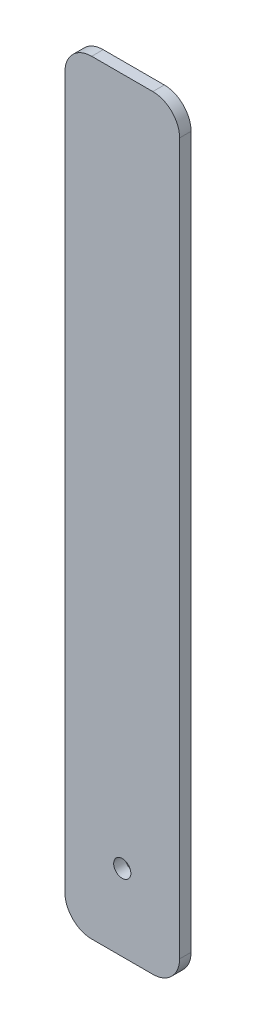
ISO-10303-21;
HEADER;
FILE_DESCRIPTION(('STEP AP214'),'2;1');
FILE_NAME('part.step','',(''),(''),'','','');
FILE_SCHEMA(('AUTOMOTIVE_DESIGN { 1 0 10303 214 1 1 1 1 }'));
ENDSEC;
DATA;
#1=APPLICATION_CONTEXT('core data for automotive mechanical design processes');
#2=APPLICATION_PROTOCOL_DEFINITION('international standard','automotive_design',2000,#1);
#3=PRODUCT_CONTEXT('',#1,'mechanical');
#4=PRODUCT('Part','Part','',(#3));
#5=PRODUCT_RELATED_PRODUCT_CATEGORY('part','',(#4));
#6=PRODUCT_DEFINITION_FORMATION('','',#4);
#7=PRODUCT_DEFINITION_CONTEXT('part definition',#1,'design');
#8=PRODUCT_DEFINITION('design','',#6,#7);
#9=PRODUCT_DEFINITION_SHAPE('','',#8);
#10=(LENGTH_UNIT() NAMED_UNIT(*) SI_UNIT(.MILLI.,.METRE.));
#11=(NAMED_UNIT(*) PLANE_ANGLE_UNIT() SI_UNIT($,.RADIAN.));
#12=(NAMED_UNIT(*) SI_UNIT($,.STERADIAN.) SOLID_ANGLE_UNIT());
#13=UNCERTAINTY_MEASURE_WITH_UNIT(LENGTH_MEASURE(1.E-05),#10,'distance_accuracy_value','');
#14=(GEOMETRIC_REPRESENTATION_CONTEXT(3) GLOBAL_UNCERTAINTY_ASSIGNED_CONTEXT((#13)) GLOBAL_UNIT_ASSIGNED_CONTEXT((#10,
#11,#12)) REPRESENTATION_CONTEXT('',''));
#15=CARTESIAN_POINT('',(0.,0.,0.));
#16=DIRECTION('',(0.,0.,1.));
#17=DIRECTION('',(1.,0.,0.));
#18=AXIS2_PLACEMENT_3D('',#15,#16,#17);
#19=CARTESIAN_POINT('',(8.,-93.,3.));
#20=DIRECTION('',(0.,0.,-1.));
#21=DIRECTION('',(-1.,0.,0.));
#22=AXIS2_PLACEMENT_3D('',#19,#20,#21);
#23=PLANE('',#22);
#24=CARTESIAN_POINT('',(8.,-93.,3.));
#25=DIRECTION('',(0.,0.,1.));
#26=DIRECTION('',(-1.,0.,0.));
#27=AXIS2_PLACEMENT_3D('',#24,#25,#26);
#28=CIRCLE('',#27,7.);
#29=CARTESIAN_POINT('',(8.,-100.,3.));
#30=VERTEX_POINT('',#29);
#31=CARTESIAN_POINT('',(15.,-93.,3.));
#32=VERTEX_POINT('',#31);
#33=EDGE_CURVE('E144',#30,#32,#28,.T.);
#34=ORIENTED_EDGE('',*,*,#33,.T.);
#35=DIRECTION('',(0.,1.,0.));
#36=VECTOR('',#35,1.);
#37=CARTESIAN_POINT('',(15.,-93.,3.));
#38=LINE('',#37,#36);
#39=CARTESIAN_POINT('',(15.,93.,3.));
#40=VERTEX_POINT('',#39);
#41=EDGE_CURVE('E92',#32,#40,#38,.T.);
#42=ORIENTED_EDGE('',*,*,#41,.T.);
#43=CARTESIAN_POINT('',(8.,93.,3.));
#44=DIRECTION('',(0.,0.,1.));
#45=DIRECTION('',(-1.,0.,0.));
#46=AXIS2_PLACEMENT_3D('',#43,#44,#45);
#47=CIRCLE('',#46,7.);
#48=CARTESIAN_POINT('',(8.,100.,3.));
#49=VERTEX_POINT('',#48);
#50=EDGE_CURVE('E159',#40,#49,#47,.T.);
#51=ORIENTED_EDGE('',*,*,#50,.T.);
#52=DIRECTION('',(-1.,0.,0.));
#53=VECTOR('',#52,1.);
#54=CARTESIAN_POINT('',(8.,100.,3.));
#55=LINE('',#54,#53);
#56=CARTESIAN_POINT('',(-8.00000000000001,100.,3.));
#57=VERTEX_POINT('',#56);
#58=EDGE_CURVE('E172',#49,#57,#55,.T.);
#59=ORIENTED_EDGE('',*,*,#58,.T.);
#60=CARTESIAN_POINT('',(-8.00000000000001,93.,3.));
#61=DIRECTION('',(0.,0.,1.));
#62=DIRECTION('',(1.,0.,0.));
#63=AXIS2_PLACEMENT_3D('',#60,#61,#62);
#64=CIRCLE('',#63,7.);
#65=CARTESIAN_POINT('',(-15.,93.,3.));
#66=VERTEX_POINT('',#65);
#67=EDGE_CURVE('E111',#57,#66,#64,.T.);
#68=ORIENTED_EDGE('',*,*,#67,.T.);
#69=DIRECTION('',(0.,-1.,0.));
#70=VECTOR('',#69,1.);
#71=CARTESIAN_POINT('',(-15.,-93.,3.));
#72=LINE('',#71,#70);
#73=CARTESIAN_POINT('',(-15.,-93.,3.));
#74=VERTEX_POINT('',#73);
#75=EDGE_CURVE('E105',#66,#74,#72,.T.);
#76=ORIENTED_EDGE('',*,*,#75,.T.);
#77=CARTESIAN_POINT('',(-8.00000000000001,-93.,3.));
#78=DIRECTION('',(0.,0.,1.));
#79=DIRECTION('',(-1.,0.,0.));
#80=AXIS2_PLACEMENT_3D('',#77,#78,#79);
#81=CIRCLE('',#80,7.);
#82=CARTESIAN_POINT('',(-8.00000000000001,-100.,3.));
#83=VERTEX_POINT('',#82);
#84=EDGE_CURVE('E109',#74,#83,#81,.T.);
#85=ORIENTED_EDGE('',*,*,#84,.T.);
#86=DIRECTION('',(1.,0.,0.));
#87=VECTOR('',#86,1.);
#88=CARTESIAN_POINT('',(8.,-100.,3.));
#89=LINE('',#88,#87);
#90=EDGE_CURVE('E49',#83,#30,#89,.T.);
#91=ORIENTED_EDGE('',*,*,#90,.T.);
#92=EDGE_LOOP('',(#34,#42,#51,#59,#68,#76,#85,#91));
#93=FACE_BOUND('',#92,.T.);
#94=CARTESIAN_POINT('',(0.,-80.,3.));
#95=DIRECTION('',(0.,0.,1.));
#96=DIRECTION('',(1.,0.,0.));
#97=AXIS2_PLACEMENT_3D('',#94,#95,#96);
#98=CIRCLE('',#97,2.25);
#99=CARTESIAN_POINT('',(2.25,-80.,3.));
#100=VERTEX_POINT('',#99);
#101=EDGE_CURVE('E133',#100,#100,#98,.T.);
#102=ORIENTED_EDGE('',*,*,#101,.F.);
#103=EDGE_LOOP('',(#102));
#104=FACE_BOUND('',#103,.T.);
#105=ADVANCED_FACE('F32',(#93,#104),#23,.F.);
#106=CARTESIAN_POINT('',(8.,-93.,0.));
#107=DIRECTION('',(0.,0.,-1.));
#108=DIRECTION('',(-1.,0.,0.));
#109=AXIS2_PLACEMENT_3D('',#106,#107,#108);
#110=PLANE('',#109);
#111=CARTESIAN_POINT('',(8.,-93.,0.));
#112=DIRECTION('',(0.,0.,1.));
#113=DIRECTION('',(-1.,0.,0.));
#114=AXIS2_PLACEMENT_3D('',#111,#112,#113);
#115=CIRCLE('',#114,7.);
#116=CARTESIAN_POINT('',(8.,-100.,0.));
#117=VERTEX_POINT('',#116);
#118=CARTESIAN_POINT('',(15.,-93.,0.));
#119=VERTEX_POINT('',#118);
#120=EDGE_CURVE('E129',#117,#119,#115,.T.);
#121=ORIENTED_EDGE('',*,*,#120,.F.);
#122=DIRECTION('',(1.,0.,0.));
#123=VECTOR('',#122,1.);
#124=CARTESIAN_POINT('',(8.,-100.,0.));
#125=LINE('',#124,#123);
#126=CARTESIAN_POINT('',(-8.00000000000001,-100.,0.));
#127=VERTEX_POINT('',#126);
#128=EDGE_CURVE('E84',#127,#117,#125,.T.);
#129=ORIENTED_EDGE('',*,*,#128,.F.);
#130=CARTESIAN_POINT('',(-8.00000000000001,-93.,0.));
#131=DIRECTION('',(0.,0.,1.));
#132=DIRECTION('',(-1.,0.,0.));
#133=AXIS2_PLACEMENT_3D('',#130,#131,#132);
#134=CIRCLE('',#133,7.);
#135=CARTESIAN_POINT('',(-15.,-93.,0.));
#136=VERTEX_POINT('',#135);
#137=EDGE_CURVE('E78',#136,#127,#134,.T.);
#138=ORIENTED_EDGE('',*,*,#137,.F.);
#139=DIRECTION('',(0.,-1.,0.));
#140=VECTOR('',#139,1.);
#141=CARTESIAN_POINT('',(-15.,-93.,0.));
#142=LINE('',#141,#140);
#143=CARTESIAN_POINT('',(-15.,93.,0.));
#144=VERTEX_POINT('',#143);
#145=EDGE_CURVE('E119',#144,#136,#142,.T.);
#146=ORIENTED_EDGE('',*,*,#145,.F.);
#147=CARTESIAN_POINT('',(-8.00000000000001,93.,0.));
#148=DIRECTION('',(0.,0.,1.));
#149=DIRECTION('',(1.,0.,0.));
#150=AXIS2_PLACEMENT_3D('',#147,#148,#149);
#151=CIRCLE('',#150,7.);
#152=CARTESIAN_POINT('',(-8.00000000000001,100.,0.));
#153=VERTEX_POINT('',#152);
#154=EDGE_CURVE('E139',#153,#144,#151,.T.);
#155=ORIENTED_EDGE('',*,*,#154,.F.);
#156=DIRECTION('',(-1.,0.,0.));
#157=VECTOR('',#156,1.);
#158=CARTESIAN_POINT('',(8.,100.,0.));
#159=LINE('',#158,#157);
#160=CARTESIAN_POINT('',(8.,100.,0.));
#161=VERTEX_POINT('',#160);
#162=EDGE_CURVE('E137',#161,#153,#159,.T.);
#163=ORIENTED_EDGE('',*,*,#162,.F.);
#164=CARTESIAN_POINT('',(8.,93.,0.));
#165=DIRECTION('',(0.,0.,1.));
#166=DIRECTION('',(-1.,0.,0.));
#167=AXIS2_PLACEMENT_3D('',#164,#165,#166);
#168=CIRCLE('',#167,7.);
#169=CARTESIAN_POINT('',(15.,93.,0.));
#170=VERTEX_POINT('',#169);
#171=EDGE_CURVE('E135',#170,#161,#168,.T.);
#172=ORIENTED_EDGE('',*,*,#171,.F.);
#173=DIRECTION('',(0.,1.,0.));
#174=VECTOR('',#173,1.);
#175=CARTESIAN_POINT('',(15.,-93.,0.));
#176=LINE('',#175,#174);
#177=EDGE_CURVE('E132',#119,#170,#176,.T.);
#178=ORIENTED_EDGE('',*,*,#177,.F.);
#179=EDGE_LOOP('',(#121,#129,#138,#146,#155,#163,#172,#178));
#180=FACE_BOUND('',#179,.T.);
#181=CARTESIAN_POINT('',(0.,-80.,0.));
#182=DIRECTION('',(0.,0.,1.));
#183=DIRECTION('',(1.,0.,0.));
#184=AXIS2_PLACEMENT_3D('',#181,#182,#183);
#185=CIRCLE('',#184,2.25);
#186=CARTESIAN_POINT('',(2.25,-80.,0.));
#187=VERTEX_POINT('',#186);
#188=EDGE_CURVE('E178',#187,#187,#185,.T.);
#189=ORIENTED_EDGE('',*,*,#188,.T.);
#190=EDGE_LOOP('',(#189));
#191=FACE_BOUND('',#190,.T.);
#192=ADVANCED_FACE('F163',(#180,#191),#110,.T.);
#193=CARTESIAN_POINT('',(8.,-93.,3.));
#194=DIRECTION('',(0.,0.,-1.));
#195=DIRECTION('',(-1.,0.,0.));
#196=AXIS2_PLACEMENT_3D('',#193,#194,#195);
#197=CYLINDRICAL_SURFACE('',#196,7.);
#198=ORIENTED_EDGE('',*,*,#120,.T.);
#199=DIRECTION('',(0.,0.,-1.));
#200=VECTOR('',#199,1.);
#201=CARTESIAN_POINT('',(15.,-93.,3.));
#202=LINE('',#201,#200);
#203=EDGE_CURVE('E11',#32,#119,#202,.T.);
#204=ORIENTED_EDGE('',*,*,#203,.F.);
#205=ORIENTED_EDGE('',*,*,#33,.F.);
#206=DIRECTION('',(0.,0.,-1.));
#207=VECTOR('',#206,1.);
#208=CARTESIAN_POINT('',(8.,-100.,3.));
#209=LINE('',#208,#207);
#210=EDGE_CURVE('E125',#30,#117,#209,.T.);
#211=ORIENTED_EDGE('',*,*,#210,.T.);
#212=EDGE_LOOP('',(#198,#204,#205,#211));
#213=FACE_BOUND('',#212,.T.);
#214=ADVANCED_FACE('F34',(#213),#197,.T.);
#215=CARTESIAN_POINT('',(15.,-93.,3.));
#216=DIRECTION('',(-1.,0.,0.));
#217=DIRECTION('',(0.,0.,1.));
#218=AXIS2_PLACEMENT_3D('',#215,#216,#217);
#219=PLANE('',#218);
#220=ORIENTED_EDGE('',*,*,#177,.T.);
#221=DIRECTION('',(0.,0.,-1.));
#222=VECTOR('',#221,1.);
#223=CARTESIAN_POINT('',(15.,93.,3.));
#224=LINE('',#223,#222);
#225=EDGE_CURVE('E41',#40,#170,#224,.T.);
#226=ORIENTED_EDGE('',*,*,#225,.F.);
#227=ORIENTED_EDGE('',*,*,#41,.F.);
#228=ORIENTED_EDGE('',*,*,#203,.T.);
#229=EDGE_LOOP('',(#220,#226,#227,#228));
#230=FACE_BOUND('',#229,.T.);
#231=ADVANCED_FACE('F206',(#230),#219,.F.);
#232=CARTESIAN_POINT('',(8.,93.,3.));
#233=DIRECTION('',(0.,0.,-1.));
#234=DIRECTION('',(-1.,0.,0.));
#235=AXIS2_PLACEMENT_3D('',#232,#233,#234);
#236=CYLINDRICAL_SURFACE('',#235,7.);
#237=ORIENTED_EDGE('',*,*,#171,.T.);
#238=DIRECTION('',(0.,0.,-1.));
#239=VECTOR('',#238,1.);
#240=CARTESIAN_POINT('',(8.,100.,3.));
#241=LINE('',#240,#239);
#242=EDGE_CURVE('E151',#49,#161,#241,.T.);
#243=ORIENTED_EDGE('',*,*,#242,.F.);
#244=ORIENTED_EDGE('',*,*,#50,.F.);
#245=ORIENTED_EDGE('',*,*,#225,.T.);
#246=EDGE_LOOP('',(#237,#243,#244,#245));
#247=FACE_BOUND('',#246,.T.);
#248=ADVANCED_FACE('F157',(#247),#236,.T.);
#249=CARTESIAN_POINT('',(8.,100.,3.));
#250=DIRECTION('',(0.,-1.,0.));
#251=DIRECTION('',(0.,0.,-1.));
#252=AXIS2_PLACEMENT_3D('',#249,#250,#251);
#253=PLANE('',#252);
#254=ORIENTED_EDGE('',*,*,#162,.T.);
#255=DIRECTION('',(0.,0.,-1.));
#256=VECTOR('',#255,1.);
#257=CARTESIAN_POINT('',(-8.00000000000001,100.,3.));
#258=LINE('',#257,#256);
#259=EDGE_CURVE('E148',#57,#153,#258,.T.);
#260=ORIENTED_EDGE('',*,*,#259,.F.);
#261=ORIENTED_EDGE('',*,*,#58,.F.);
#262=ORIENTED_EDGE('',*,*,#242,.T.);
#263=EDGE_LOOP('',(#254,#260,#261,#262));
#264=FACE_BOUND('',#263,.T.);
#265=ADVANCED_FACE('F168',(#264),#253,.F.);
#266=CARTESIAN_POINT('',(-8.00000000000001,93.,3.));
#267=DIRECTION('',(0.,0.,-1.));
#268=DIRECTION('',(-1.,0.,0.));
#269=AXIS2_PLACEMENT_3D('',#266,#267,#268);
#270=CYLINDRICAL_SURFACE('',#269,7.);
#271=ORIENTED_EDGE('',*,*,#154,.T.);
#272=DIRECTION('',(0.,0.,-1.));
#273=VECTOR('',#272,1.);
#274=CARTESIAN_POINT('',(-15.,93.,3.));
#275=LINE('',#274,#273);
#276=EDGE_CURVE('E120',#66,#144,#275,.T.);
#277=ORIENTED_EDGE('',*,*,#276,.F.);
#278=ORIENTED_EDGE('',*,*,#67,.F.);
#279=ORIENTED_EDGE('',*,*,#259,.T.);
#280=EDGE_LOOP('',(#271,#277,#278,#279));
#281=FACE_BOUND('',#280,.T.);
#282=ADVANCED_FACE('F171',(#281),#270,.T.);
#283=CARTESIAN_POINT('',(-15.,-93.,3.));
#284=DIRECTION('',(1.,0.,0.));
#285=DIRECTION('',(0.,0.,-1.));
#286=AXIS2_PLACEMENT_3D('',#283,#284,#285);
#287=PLANE('',#286);
#288=ORIENTED_EDGE('',*,*,#145,.T.);
#289=DIRECTION('',(0.,0.,-1.));
#290=VECTOR('',#289,1.);
#291=CARTESIAN_POINT('',(-15.,-93.,3.));
#292=LINE('',#291,#290);
#293=EDGE_CURVE('E116',#74,#136,#292,.T.);
#294=ORIENTED_EDGE('',*,*,#293,.F.);
#295=ORIENTED_EDGE('',*,*,#75,.F.);
#296=ORIENTED_EDGE('',*,*,#276,.T.);
#297=EDGE_LOOP('',(#288,#294,#295,#296));
#298=FACE_BOUND('',#297,.T.);
#299=ADVANCED_FACE('F117',(#298),#287,.F.);
#300=CARTESIAN_POINT('',(-8.00000000000001,-93.,3.));
#301=DIRECTION('',(0.,0.,-1.));
#302=DIRECTION('',(-1.,0.,0.));
#303=AXIS2_PLACEMENT_3D('',#300,#301,#302);
#304=CYLINDRICAL_SURFACE('',#303,7.);
#305=ORIENTED_EDGE('',*,*,#137,.T.);
#306=DIRECTION('',(0.,0.,-1.));
#307=VECTOR('',#306,1.);
#308=CARTESIAN_POINT('',(-8.00000000000001,-100.,3.));
#309=LINE('',#308,#307);
#310=EDGE_CURVE('E121',#83,#127,#309,.T.);
#311=ORIENTED_EDGE('',*,*,#310,.F.);
#312=ORIENTED_EDGE('',*,*,#84,.F.);
#313=ORIENTED_EDGE('',*,*,#293,.T.);
#314=EDGE_LOOP('',(#305,#311,#312,#313));
#315=FACE_BOUND('',#314,.T.);
#316=ADVANCED_FACE('F123',(#315),#304,.T.);
#317=CARTESIAN_POINT('',(8.,-100.,3.));
#318=DIRECTION('',(0.,1.,0.));
#319=DIRECTION('',(0.,0.,1.));
#320=AXIS2_PLACEMENT_3D('',#317,#318,#319);
#321=PLANE('',#320);
#322=ORIENTED_EDGE('',*,*,#128,.T.);
#323=ORIENTED_EDGE('',*,*,#210,.F.);
#324=ORIENTED_EDGE('',*,*,#90,.F.);
#325=ORIENTED_EDGE('',*,*,#310,.T.);
#326=EDGE_LOOP('',(#322,#323,#324,#325));
#327=FACE_BOUND('',#326,.T.);
#328=ADVANCED_FACE('F194',(#327),#321,.F.);
#329=CARTESIAN_POINT('',(0.,-80.,3.));
#330=DIRECTION('',(0.,0.,-1.));
#331=DIRECTION('',(-1.,0.,0.));
#332=AXIS2_PLACEMENT_3D('',#329,#330,#331);
#333=CYLINDRICAL_SURFACE('',#332,2.25);
#334=ORIENTED_EDGE('',*,*,#101,.T.);
#335=EDGE_LOOP('',(#334));
#336=FACE_BOUND('',#335,.T.);
#337=ORIENTED_EDGE('',*,*,#188,.F.);
#338=EDGE_LOOP('',(#337));
#339=FACE_BOUND('',#338,.T.);
#340=ADVANCED_FACE('F184',(#336,#339),#333,.F.);
#341=CLOSED_SHELL('',(#105,#192,#214,#231,#248,#265,#282,#299,#316,#328,#340));
#342=MANIFOLD_SOLID_BREP('B2',#341);
#343=ADVANCED_BREP_SHAPE_REPRESENTATION('',(#18,#342),#14);
#344=SHAPE_DEFINITION_REPRESENTATION(#9,#343);
ENDSEC;
END-ISO-10303-21;
